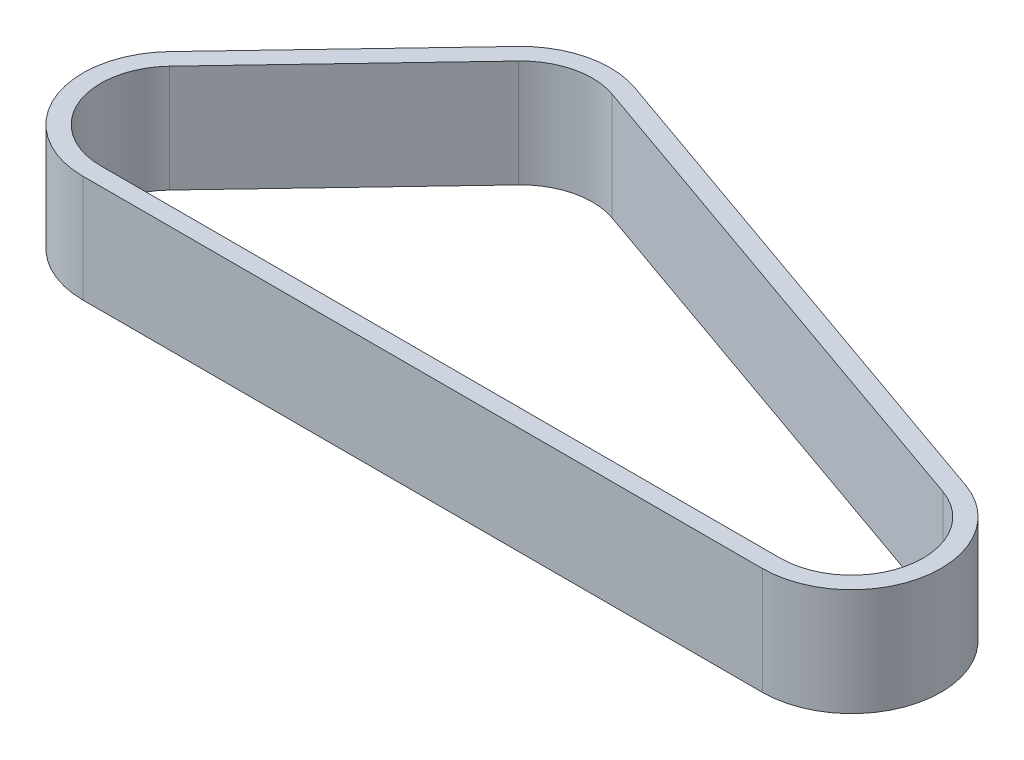
ISO-10303-21;
HEADER;
FILE_DESCRIPTION(('STEP AP214'),'2;1');
FILE_NAME('part.step','',(''),(''),'','','');
FILE_SCHEMA(('AUTOMOTIVE_DESIGN { 1 0 10303 214 1 1 1 1 }'));
ENDSEC;
DATA;
#1=APPLICATION_CONTEXT('core data for automotive mechanical design processes');
#2=APPLICATION_PROTOCOL_DEFINITION('international standard','automotive_design',2000,#1);
#3=PRODUCT_CONTEXT('',#1,'mechanical');
#4=PRODUCT('Part','Part','',(#3));
#5=PRODUCT_RELATED_PRODUCT_CATEGORY('part','',(#4));
#6=PRODUCT_DEFINITION_FORMATION('','',#4);
#7=PRODUCT_DEFINITION_CONTEXT('part definition',#1,'design');
#8=PRODUCT_DEFINITION('design','',#6,#7);
#9=PRODUCT_DEFINITION_SHAPE('','',#8);
#10=(LENGTH_UNIT() NAMED_UNIT(*) SI_UNIT(.MILLI.,.METRE.));
#11=(NAMED_UNIT(*) PLANE_ANGLE_UNIT() SI_UNIT($,.RADIAN.));
#12=(NAMED_UNIT(*) SI_UNIT($,.STERADIAN.) SOLID_ANGLE_UNIT());
#13=UNCERTAINTY_MEASURE_WITH_UNIT(LENGTH_MEASURE(1.E-05),#10,'distance_accuracy_value','');
#14=(GEOMETRIC_REPRESENTATION_CONTEXT(3) GLOBAL_UNCERTAINTY_ASSIGNED_CONTEXT((#13)) GLOBAL_UNIT_ASSIGNED_CONTEXT((#10,
#11,#12)) REPRESENTATION_CONTEXT('',''));
#15=CARTESIAN_POINT('',(0.,0.,0.));
#16=DIRECTION('',(0.,0.,1.));
#17=DIRECTION('',(1.,0.,0.));
#18=AXIS2_PLACEMENT_3D('',#15,#16,#17);
#19=CARTESIAN_POINT('',(-92.2026887606525,30.,-87.6819302663437));
#20=DIRECTION('',(0.,1.,0.));
#21=DIRECTION('',(0.,0.,1.));
#22=AXIS2_PLACEMENT_3D('',#19,#20,#21);
#23=PLANE('',#22);
#24=CARTESIAN_POINT('',(-92.2026887606525,30.,-87.6819302663437));
#25=DIRECTION('',(0.,1.,0.));
#26=DIRECTION('',(0.,0.,1.));
#27=AXIS2_PLACEMENT_3D('',#24,#25,#26);
#28=CIRCLE('',#27,50.0000000000002);
#29=CARTESIAN_POINT('',(-75.6483031091984,30.,-134.861929372988));
#30=VERTEX_POINT('',#29);
#31=CARTESIAN_POINT('',(-128.452660440373,30.,-122.119403362079));
#32=VERTEX_POINT('',#31);
#33=EDGE_CURVE('E177',#30,#32,#28,.T.);
#34=ORIENTED_EDGE('',*,*,#33,.T.);
#35=DIRECTION('',(-0.688749461914693,0.,0.724999433594414));
#36=VECTOR('',#35,1.);
#37=CARTESIAN_POINT('',(-128.452660440373,30.,-122.119403362079));
#38=LINE('',#37,#36);
#39=CARTESIAN_POINT('',(-223.452660440373,30.,-22.1194033620784));
#40=VERTEX_POINT('',#39);
#41=EDGE_CURVE('E180',#32,#40,#38,.T.);
#42=ORIENTED_EDGE('',*,*,#41,.T.);
#43=CARTESIAN_POINT('',(-187.202688760653,30.,12.3180697336563));
#44=DIRECTION('',(0.,1.,0.));
#45=DIRECTION('',(0.,0.,1.));
#46=AXIS2_PLACEMENT_3D('',#43,#44,#45);
#47=CIRCLE('',#46,50.);
#48=CARTESIAN_POINT('',(-187.202688760653,30.,62.3180697336562));
#49=VERTEX_POINT('',#48);
#50=EDGE_CURVE('E183',#40,#49,#47,.T.);
#51=ORIENTED_EDGE('',*,*,#50,.T.);
#52=DIRECTION('',(1.,0.,0.));
#53=VECTOR('',#52,1.);
#54=CARTESIAN_POINT('',(-187.202688760653,30.,62.3180697336562));
#55=LINE('',#54,#53);
#56=CARTESIAN_POINT('',(192.797311239347,30.,62.3180697336563));
#57=VERTEX_POINT('',#56);
#58=EDGE_CURVE('E185',#49,#57,#55,.T.);
#59=ORIENTED_EDGE('',*,*,#58,.T.);
#60=CARTESIAN_POINT('',(192.797311239347,30.,12.3180697336562));
#61=DIRECTION('',(0.,1.,0.));
#62=DIRECTION('',(0.,0.,1.));
#63=AXIS2_PLACEMENT_3D('',#60,#61,#62);
#64=CIRCLE('',#63,50.0000000000001);
#65=CARTESIAN_POINT('',(209.351696890802,30.,-34.861929372988));
#66=VERTEX_POINT('',#65);
#67=EDGE_CURVE('E187',#57,#66,#64,.T.);
#68=ORIENTED_EDGE('',*,*,#67,.T.);
#69=DIRECTION('',(-0.943599982132881,0.,-0.331087713029081));
#70=VECTOR('',#69,1.);
#71=CARTESIAN_POINT('',(-75.6483031091984,30.,-134.861929372988));
#72=LINE('',#71,#70);
#73=EDGE_CURVE('E189',#66,#30,#72,.T.);
#74=ORIENTED_EDGE('',*,*,#73,.T.);
#75=EDGE_LOOP('',(#34,#42,#51,#59,#68,#74));
#76=FACE_BOUND('',#75,.T.);
#77=DIRECTION('',(-0.688749461914693,0.,0.724999433594414));
#78=VECTOR('',#77,1.);
#79=CARTESIAN_POINT('',(-121.202666104429,30.,-115.231908742931));
#80=LINE('',#79,#78);
#81=CARTESIAN_POINT('',(-121.202666104429,30.,-115.231908742931));
#82=VERTEX_POINT('',#81);
#83=CARTESIAN_POINT('',(-216.202666104429,30.,-15.2319087429315));
#84=VERTEX_POINT('',#83);
#85=EDGE_CURVE('E134',#82,#84,#80,.T.);
#86=ORIENTED_EDGE('',*,*,#85,.F.);
#87=CARTESIAN_POINT('',(-92.2026887606525,30.,-87.6819302663437));
#88=DIRECTION('',(0.,1.,0.));
#89=DIRECTION('',(0.,0.,1.));
#90=AXIS2_PLACEMENT_3D('',#87,#88,#89);
#91=CIRCLE('',#90,40.0000000000001);
#92=CARTESIAN_POINT('',(-78.9591802394892,30.,-125.425929551659));
#93=VERTEX_POINT('',#92);
#94=EDGE_CURVE('E126',#93,#82,#91,.T.);
#95=ORIENTED_EDGE('',*,*,#94,.F.);
#96=DIRECTION('',(-0.943599982132881,0.,-0.331087713029081));
#97=VECTOR('',#96,1.);
#98=CARTESIAN_POINT('',(-78.9591802394892,30.,-125.425929551659));
#99=LINE('',#98,#97);
#100=CARTESIAN_POINT('',(206.040819760511,30.,-25.4259295516592));
#101=VERTEX_POINT('',#100);
#102=EDGE_CURVE('E155',#101,#93,#99,.T.);
#103=ORIENTED_EDGE('',*,*,#102,.F.);
#104=CARTESIAN_POINT('',(192.797311239347,30.,12.3180697336562));
#105=DIRECTION('',(0.,1.,0.));
#106=DIRECTION('',(0.,0.,1.));
#107=AXIS2_PLACEMENT_3D('',#104,#105,#106);
#108=CIRCLE('',#107,40.);
#109=CARTESIAN_POINT('',(192.797311239347,30.,52.3180697336561));
#110=VERTEX_POINT('',#109);
#111=EDGE_CURVE('E153',#110,#101,#108,.T.);
#112=ORIENTED_EDGE('',*,*,#111,.F.);
#113=DIRECTION('',(1.,0.,0.));
#114=VECTOR('',#113,1.);
#115=CARTESIAN_POINT('',(-187.202688760653,30.,52.3180697336562));
#116=LINE('',#115,#114);
#117=CARTESIAN_POINT('',(-187.202688760653,30.,52.3180697336562));
#118=VERTEX_POINT('',#117);
#119=EDGE_CURVE('E149',#118,#110,#116,.T.);
#120=ORIENTED_EDGE('',*,*,#119,.F.);
#121=CARTESIAN_POINT('',(-187.202688760653,30.,12.3180697336563));
#122=DIRECTION('',(0.,1.,0.));
#123=DIRECTION('',(0.,0.,1.));
#124=AXIS2_PLACEMENT_3D('',#121,#122,#123);
#125=CIRCLE('',#124,40.);
#126=EDGE_CURVE('E147',#84,#118,#125,.T.);
#127=ORIENTED_EDGE('',*,*,#126,.F.);
#128=EDGE_LOOP('',(#86,#95,#103,#112,#120,#127));
#129=FACE_BOUND('',#128,.T.);
#130=ADVANCED_FACE('F37',(#76,#129),#23,.T.);
#131=CARTESIAN_POINT('',(-92.2026887606525,-30.,-87.6819302663437));
#132=DIRECTION('',(0.,1.,0.));
#133=DIRECTION('',(0.,0.,1.));
#134=AXIS2_PLACEMENT_3D('',#131,#132,#133);
#135=PLANE('',#134);
#136=CARTESIAN_POINT('',(-92.2026887606525,-30.,-87.6819302663437));
#137=DIRECTION('',(0.,1.,0.));
#138=DIRECTION('',(0.,0.,1.));
#139=AXIS2_PLACEMENT_3D('',#136,#137,#138);
#140=CIRCLE('',#139,50.0000000000002);
#141=CARTESIAN_POINT('',(-75.6483031091984,-30.,-134.861929372988));
#142=VERTEX_POINT('',#141);
#143=CARTESIAN_POINT('',(-128.452660440373,-30.,-122.119403362079));
#144=VERTEX_POINT('',#143);
#145=EDGE_CURVE('E142',#142,#144,#140,.T.);
#146=ORIENTED_EDGE('',*,*,#145,.F.);
#147=DIRECTION('',(-0.943599982132881,0.,-0.331087713029081));
#148=VECTOR('',#147,1.);
#149=CARTESIAN_POINT('',(-75.6483031091984,-30.,-134.861929372988));
#150=LINE('',#149,#148);
#151=CARTESIAN_POINT('',(209.351696890802,-30.,-34.861929372988));
#152=VERTEX_POINT('',#151);
#153=EDGE_CURVE('E181',#152,#142,#150,.T.);
#154=ORIENTED_EDGE('',*,*,#153,.F.);
#155=CARTESIAN_POINT('',(192.797311239347,-30.,12.3180697336562));
#156=DIRECTION('',(0.,1.,0.));
#157=DIRECTION('',(0.,0.,1.));
#158=AXIS2_PLACEMENT_3D('',#155,#156,#157);
#159=CIRCLE('',#158,50.0000000000001);
#160=CARTESIAN_POINT('',(192.797311239347,-30.,62.3180697336563));
#161=VERTEX_POINT('',#160);
#162=EDGE_CURVE('E200',#161,#152,#159,.T.);
#163=ORIENTED_EDGE('',*,*,#162,.F.);
#164=DIRECTION('',(1.,0.,0.));
#165=VECTOR('',#164,1.);
#166=CARTESIAN_POINT('',(-187.202688760653,-30.,62.3180697336562));
#167=LINE('',#166,#165);
#168=CARTESIAN_POINT('',(-187.202688760653,-30.,62.3180697336562));
#169=VERTEX_POINT('',#168);
#170=EDGE_CURVE('E198',#169,#161,#167,.T.);
#171=ORIENTED_EDGE('',*,*,#170,.F.);
#172=CARTESIAN_POINT('',(-187.202688760653,-30.,12.3180697336563));
#173=DIRECTION('',(0.,1.,0.));
#174=DIRECTION('',(0.,0.,1.));
#175=AXIS2_PLACEMENT_3D('',#172,#173,#174);
#176=CIRCLE('',#175,50.);
#177=CARTESIAN_POINT('',(-223.452660440373,-30.,-22.1194033620784));
#178=VERTEX_POINT('',#177);
#179=EDGE_CURVE('E196',#178,#169,#176,.T.);
#180=ORIENTED_EDGE('',*,*,#179,.F.);
#181=DIRECTION('',(-0.688749461914693,0.,0.724999433594414));
#182=VECTOR('',#181,1.);
#183=CARTESIAN_POINT('',(-128.452660440373,-30.,-122.119403362079));
#184=LINE('',#183,#182);
#185=EDGE_CURVE('E194',#144,#178,#184,.T.);
#186=ORIENTED_EDGE('',*,*,#185,.F.);
#187=EDGE_LOOP('',(#146,#154,#163,#171,#180,#186));
#188=FACE_BOUND('',#187,.T.);
#189=CARTESIAN_POINT('',(-92.2026887606525,-30.,-87.6819302663437));
#190=DIRECTION('',(0.,1.,0.));
#191=DIRECTION('',(0.,0.,1.));
#192=AXIS2_PLACEMENT_3D('',#189,#190,#191);
#193=CIRCLE('',#192,40.0000000000001);
#194=CARTESIAN_POINT('',(-78.9591802394892,-30.,-125.425929551659));
#195=VERTEX_POINT('',#194);
#196=CARTESIAN_POINT('',(-121.202666104429,-30.,-115.231908742931));
#197=VERTEX_POINT('',#196);
#198=EDGE_CURVE('E60',#195,#197,#193,.T.);
#199=ORIENTED_EDGE('',*,*,#198,.T.);
#200=DIRECTION('',(-0.688749461914693,0.,0.724999433594414));
#201=VECTOR('',#200,1.);
#202=CARTESIAN_POINT('',(-121.202666104429,-30.,-115.231908742931));
#203=LINE('',#202,#201);
#204=CARTESIAN_POINT('',(-216.202666104429,-30.,-15.2319087429315));
#205=VERTEX_POINT('',#204);
#206=EDGE_CURVE('E141',#197,#205,#203,.T.);
#207=ORIENTED_EDGE('',*,*,#206,.T.);
#208=CARTESIAN_POINT('',(-187.202688760653,-30.,12.3180697336563));
#209=DIRECTION('',(0.,1.,0.));
#210=DIRECTION('',(0.,0.,1.));
#211=AXIS2_PLACEMENT_3D('',#208,#209,#210);
#212=CIRCLE('',#211,40.);
#213=CARTESIAN_POINT('',(-187.202688760653,-30.,52.3180697336562));
#214=VERTEX_POINT('',#213);
#215=EDGE_CURVE('E159',#205,#214,#212,.T.);
#216=ORIENTED_EDGE('',*,*,#215,.T.);
#217=DIRECTION('',(1.,0.,0.));
#218=VECTOR('',#217,1.);
#219=CARTESIAN_POINT('',(-187.202688760653,-30.,52.3180697336562));
#220=LINE('',#219,#218);
#221=CARTESIAN_POINT('',(192.797311239347,-30.,52.3180697336561));
#222=VERTEX_POINT('',#221);
#223=EDGE_CURVE('E162',#214,#222,#220,.T.);
#224=ORIENTED_EDGE('',*,*,#223,.T.);
#225=CARTESIAN_POINT('',(192.797311239347,-30.,12.3180697336562));
#226=DIRECTION('',(0.,1.,0.));
#227=DIRECTION('',(0.,0.,1.));
#228=AXIS2_PLACEMENT_3D('',#225,#226,#227);
#229=CIRCLE('',#228,40.);
#230=CARTESIAN_POINT('',(206.040819760511,-30.,-25.4259295516591));
#231=VERTEX_POINT('',#230);
#232=EDGE_CURVE('E165',#222,#231,#229,.T.);
#233=ORIENTED_EDGE('',*,*,#232,.T.);
#234=DIRECTION('',(-0.943599982132881,0.,-0.331087713029081));
#235=VECTOR('',#234,1.);
#236=CARTESIAN_POINT('',(-78.9591802394892,-30.,-125.425929551659));
#237=LINE('',#236,#235);
#238=EDGE_CURVE('E135',#231,#195,#237,.T.);
#239=ORIENTED_EDGE('',*,*,#238,.T.);
#240=EDGE_LOOP('',(#199,#207,#216,#224,#233,#239));
#241=FACE_BOUND('',#240,.T.);
#242=ADVANCED_FACE('F224',(#188,#241),#135,.F.);
#243=CARTESIAN_POINT('',(-92.2026887606525,30.,-87.6819302663437));
#244=DIRECTION('',(0.,-1.,0.));
#245=DIRECTION('',(0.,0.,-1.));
#246=AXIS2_PLACEMENT_3D('',#243,#244,#245);
#247=CYLINDRICAL_SURFACE('',#246,50.0000000000002);
#248=ORIENTED_EDGE('',*,*,#145,.T.);
#249=DIRECTION('',(0.,-1.,0.));
#250=VECTOR('',#249,1.);
#251=CARTESIAN_POINT('',(-128.452660440373,30.,-122.119403362079));
#252=LINE('',#251,#250);
#253=EDGE_CURVE('E11',#32,#144,#252,.T.);
#254=ORIENTED_EDGE('',*,*,#253,.F.);
#255=ORIENTED_EDGE('',*,*,#33,.F.);
#256=DIRECTION('',(0.,-1.,0.));
#257=VECTOR('',#256,1.);
#258=CARTESIAN_POINT('',(-75.6483031091984,30.,-134.861929372988));
#259=LINE('',#258,#257);
#260=EDGE_CURVE('E191',#30,#142,#259,.T.);
#261=ORIENTED_EDGE('',*,*,#260,.T.);
#262=EDGE_LOOP('',(#248,#254,#255,#261));
#263=FACE_BOUND('',#262,.T.);
#264=ADVANCED_FACE('F39',(#263),#247,.T.);
#265=CARTESIAN_POINT('',(-128.452660440373,30.,-122.119403362079));
#266=DIRECTION('',(0.724999433594414,0.,0.688749461914693));
#267=DIRECTION('',(0.688749461914693,0.,-0.724999433594414));
#268=AXIS2_PLACEMENT_3D('',#265,#266,#267);
#269=PLANE('',#268);
#270=ORIENTED_EDGE('',*,*,#185,.T.);
#271=DIRECTION('',(0.,-1.,0.));
#272=VECTOR('',#271,1.);
#273=CARTESIAN_POINT('',(-223.452660440373,30.,-22.1194033620784));
#274=LINE('',#273,#272);
#275=EDGE_CURVE('E45',#40,#178,#274,.T.);
#276=ORIENTED_EDGE('',*,*,#275,.F.);
#277=ORIENTED_EDGE('',*,*,#41,.F.);
#278=ORIENTED_EDGE('',*,*,#253,.T.);
#279=EDGE_LOOP('',(#270,#276,#277,#278));
#280=FACE_BOUND('',#279,.T.);
#281=ADVANCED_FACE('F241',(#280),#269,.F.);
#282=CARTESIAN_POINT('',(-187.202688760653,30.,12.3180697336563));
#283=DIRECTION('',(0.,-1.,0.));
#284=DIRECTION('',(0.,0.,-1.));
#285=AXIS2_PLACEMENT_3D('',#282,#283,#284);
#286=CYLINDRICAL_SURFACE('',#285,50.);
#287=ORIENTED_EDGE('',*,*,#179,.T.);
#288=DIRECTION('',(0.,-1.,0.));
#289=VECTOR('',#288,1.);
#290=CARTESIAN_POINT('',(-187.202688760653,30.,62.3180697336562));
#291=LINE('',#290,#289);
#292=EDGE_CURVE('E211',#49,#169,#291,.T.);
#293=ORIENTED_EDGE('',*,*,#292,.F.);
#294=ORIENTED_EDGE('',*,*,#50,.F.);
#295=ORIENTED_EDGE('',*,*,#275,.T.);
#296=EDGE_LOOP('',(#287,#293,#294,#295));
#297=FACE_BOUND('',#296,.T.);
#298=ADVANCED_FACE('F218',(#297),#286,.T.);
#299=CARTESIAN_POINT('',(-187.202688760653,30.,62.3180697336562));
#300=DIRECTION('',(0.,0.,-1.));
#301=DIRECTION('',(-1.,0.,0.));
#302=AXIS2_PLACEMENT_3D('',#299,#300,#301);
#303=PLANE('',#302);
#304=ORIENTED_EDGE('',*,*,#170,.T.);
#305=DIRECTION('',(0.,-1.,0.));
#306=VECTOR('',#305,1.);
#307=CARTESIAN_POINT('',(192.797311239347,30.,62.3180697336563));
#308=LINE('',#307,#306);
#309=EDGE_CURVE('E208',#57,#161,#308,.T.);
#310=ORIENTED_EDGE('',*,*,#309,.F.);
#311=ORIENTED_EDGE('',*,*,#58,.F.);
#312=ORIENTED_EDGE('',*,*,#292,.T.);
#313=EDGE_LOOP('',(#304,#310,#311,#312));
#314=FACE_BOUND('',#313,.T.);
#315=ADVANCED_FACE('F230',(#314),#303,.F.);
#316=CARTESIAN_POINT('',(192.797311239347,30.,12.3180697336562));
#317=DIRECTION('',(0.,-1.,0.));
#318=DIRECTION('',(0.,0.,-1.));
#319=AXIS2_PLACEMENT_3D('',#316,#317,#318);
#320=CYLINDRICAL_SURFACE('',#319,50.0000000000001);
#321=ORIENTED_EDGE('',*,*,#162,.T.);
#322=DIRECTION('',(0.,-1.,0.));
#323=VECTOR('',#322,1.);
#324=CARTESIAN_POINT('',(209.351696890802,30.,-34.861929372988));
#325=LINE('',#324,#323);
#326=EDGE_CURVE('E205',#66,#152,#325,.T.);
#327=ORIENTED_EDGE('',*,*,#326,.F.);
#328=ORIENTED_EDGE('',*,*,#67,.F.);
#329=ORIENTED_EDGE('',*,*,#309,.T.);
#330=EDGE_LOOP('',(#321,#327,#328,#329));
#331=FACE_BOUND('',#330,.T.);
#332=ADVANCED_FACE('F234',(#331),#320,.T.);
#333=CARTESIAN_POINT('',(-75.6483031091984,30.,-134.861929372988));
#334=DIRECTION('',(-0.331087713029081,0.,0.943599982132881));
#335=DIRECTION('',(0.943599982132881,0.,0.331087713029081));
#336=AXIS2_PLACEMENT_3D('',#333,#334,#335);
#337=PLANE('',#336);
#338=ORIENTED_EDGE('',*,*,#153,.T.);
#339=ORIENTED_EDGE('',*,*,#260,.F.);
#340=ORIENTED_EDGE('',*,*,#73,.F.);
#341=ORIENTED_EDGE('',*,*,#326,.T.);
#342=EDGE_LOOP('',(#338,#339,#340,#341));
#343=FACE_BOUND('',#342,.T.);
#344=ADVANCED_FACE('F244',(#343),#337,.F.);
#345=CARTESIAN_POINT('',(-92.2026887606525,30.,-87.6819302663437));
#346=DIRECTION('',(0.,-1.,0.));
#347=DIRECTION('',(0.,0.,-1.));
#348=AXIS2_PLACEMENT_3D('',#345,#346,#347);
#349=CYLINDRICAL_SURFACE('',#348,40.0000000000001);
#350=ORIENTED_EDGE('',*,*,#198,.F.);
#351=DIRECTION('',(0.,-1.,0.));
#352=VECTOR('',#351,1.);
#353=CARTESIAN_POINT('',(-78.9591802394892,30.,-125.425929551659));
#354=LINE('',#353,#352);
#355=EDGE_CURVE('E130',#93,#195,#354,.T.);
#356=ORIENTED_EDGE('',*,*,#355,.F.);
#357=ORIENTED_EDGE('',*,*,#94,.T.);
#358=DIRECTION('',(0.,-1.,0.));
#359=VECTOR('',#358,1.);
#360=CARTESIAN_POINT('',(-121.202666104429,30.,-115.231908742931));
#361=LINE('',#360,#359);
#362=EDGE_CURVE('E129',#82,#197,#361,.T.);
#363=ORIENTED_EDGE('',*,*,#362,.T.);
#364=EDGE_LOOP('',(#350,#356,#357,#363));
#365=FACE_BOUND('',#364,.T.);
#366=ADVANCED_FACE('F128',(#365),#349,.F.);
#367=CARTESIAN_POINT('',(-121.202666104429,30.,-115.231908742931));
#368=DIRECTION('',(0.724999433594414,0.,0.688749461914693));
#369=DIRECTION('',(0.688749461914693,0.,-0.724999433594414));
#370=AXIS2_PLACEMENT_3D('',#367,#368,#369);
#371=PLANE('',#370);
#372=ORIENTED_EDGE('',*,*,#206,.F.);
#373=ORIENTED_EDGE('',*,*,#362,.F.);
#374=ORIENTED_EDGE('',*,*,#85,.T.);
#375=DIRECTION('',(0.,-1.,0.));
#376=VECTOR('',#375,1.);
#377=CARTESIAN_POINT('',(-216.202666104429,30.,-15.2319087429315));
#378=LINE('',#377,#376);
#379=EDGE_CURVE('E143',#84,#205,#378,.T.);
#380=ORIENTED_EDGE('',*,*,#379,.T.);
#381=EDGE_LOOP('',(#372,#373,#374,#380));
#382=FACE_BOUND('',#381,.T.);
#383=ADVANCED_FACE('F138',(#382),#371,.T.);
#384=CARTESIAN_POINT('',(-187.202688760653,30.,12.3180697336563));
#385=DIRECTION('',(0.,-1.,0.));
#386=DIRECTION('',(0.,0.,-1.));
#387=AXIS2_PLACEMENT_3D('',#384,#385,#386);
#388=CYLINDRICAL_SURFACE('',#387,40.);
#389=ORIENTED_EDGE('',*,*,#215,.F.);
#390=ORIENTED_EDGE('',*,*,#379,.F.);
#391=ORIENTED_EDGE('',*,*,#126,.T.);
#392=DIRECTION('',(0.,-1.,0.));
#393=VECTOR('',#392,1.);
#394=CARTESIAN_POINT('',(-187.202688760653,30.,52.3180697336562));
#395=LINE('',#394,#393);
#396=EDGE_CURVE('E174',#118,#214,#395,.T.);
#397=ORIENTED_EDGE('',*,*,#396,.T.);
#398=EDGE_LOOP('',(#389,#390,#391,#397));
#399=FACE_BOUND('',#398,.T.);
#400=ADVANCED_FACE('F262',(#399),#388,.F.);
#401=CARTESIAN_POINT('',(-187.202688760653,30.,52.3180697336562));
#402=DIRECTION('',(0.,0.,-1.));
#403=DIRECTION('',(-1.,0.,0.));
#404=AXIS2_PLACEMENT_3D('',#401,#402,#403);
#405=PLANE('',#404);
#406=ORIENTED_EDGE('',*,*,#223,.F.);
#407=ORIENTED_EDGE('',*,*,#396,.F.);
#408=ORIENTED_EDGE('',*,*,#119,.T.);
#409=DIRECTION('',(0.,-1.,0.));
#410=VECTOR('',#409,1.);
#411=CARTESIAN_POINT('',(192.797311239347,30.,52.3180697336561));
#412=LINE('',#411,#410);
#413=EDGE_CURVE('E172',#110,#222,#412,.T.);
#414=ORIENTED_EDGE('',*,*,#413,.T.);
#415=EDGE_LOOP('',(#406,#407,#408,#414));
#416=FACE_BOUND('',#415,.T.);
#417=ADVANCED_FACE('F265',(#416),#405,.T.);
#418=CARTESIAN_POINT('',(192.797311239347,30.,12.3180697336562));
#419=DIRECTION('',(0.,-1.,0.));
#420=DIRECTION('',(0.,0.,-1.));
#421=AXIS2_PLACEMENT_3D('',#418,#419,#420);
#422=CYLINDRICAL_SURFACE('',#421,40.);
#423=ORIENTED_EDGE('',*,*,#232,.F.);
#424=ORIENTED_EDGE('',*,*,#413,.F.);
#425=ORIENTED_EDGE('',*,*,#111,.T.);
#426=DIRECTION('',(0.,-1.,0.));
#427=VECTOR('',#426,1.);
#428=CARTESIAN_POINT('',(206.040819760511,30.,-25.4259295516591));
#429=LINE('',#428,#427);
#430=EDGE_CURVE('E52',#101,#231,#429,.T.);
#431=ORIENTED_EDGE('',*,*,#430,.T.);
#432=EDGE_LOOP('',(#423,#424,#425,#431));
#433=FACE_BOUND('',#432,.T.);
#434=ADVANCED_FACE('F269',(#433),#422,.F.);
#435=CARTESIAN_POINT('',(-78.9591802394892,30.,-125.425929551659));
#436=DIRECTION('',(-0.331087713029081,0.,0.943599982132881));
#437=DIRECTION('',(0.943599982132881,0.,0.331087713029081));
#438=AXIS2_PLACEMENT_3D('',#435,#436,#437);
#439=PLANE('',#438);
#440=ORIENTED_EDGE('',*,*,#238,.F.);
#441=ORIENTED_EDGE('',*,*,#430,.F.);
#442=ORIENTED_EDGE('',*,*,#102,.T.);
#443=ORIENTED_EDGE('',*,*,#355,.T.);
#444=EDGE_LOOP('',(#440,#441,#442,#443));
#445=FACE_BOUND('',#444,.T.);
#446=ADVANCED_FACE('F273',(#445),#439,.T.);
#447=CLOSED_SHELL('',(#130,#242,#264,#281,#298,#315,#332,#344,#366,#383,#400,#417,#434,#446));
#448=MANIFOLD_SOLID_BREP('B2',#447);
#449=ADVANCED_BREP_SHAPE_REPRESENTATION('',(#18,#448),#14);
#450=SHAPE_DEFINITION_REPRESENTATION(#9,#449);
ENDSEC;
END-ISO-10303-21;
